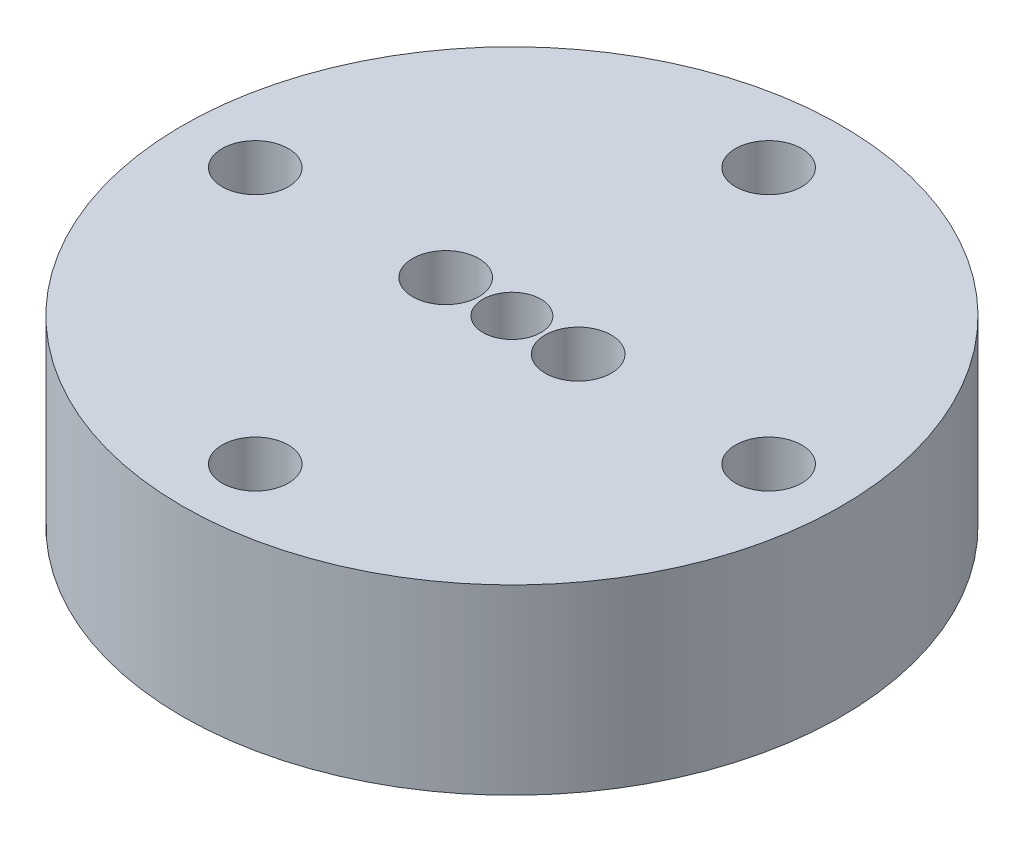
ISO-10303-21;
HEADER;
FILE_DESCRIPTION(('STEP AP214'),'2;1');
FILE_NAME('part.step','',(''),(''),'','','');
FILE_SCHEMA(('AUTOMOTIVE_DESIGN { 1 0 10303 214 1 1 1 1 }'));
ENDSEC;
DATA;
#1=APPLICATION_CONTEXT('core data for automotive mechanical design processes');
#2=APPLICATION_PROTOCOL_DEFINITION('international standard','automotive_design',2000,#1);
#3=PRODUCT_CONTEXT('',#1,'mechanical');
#4=PRODUCT('Part','Part','',(#3));
#5=PRODUCT_RELATED_PRODUCT_CATEGORY('part','',(#4));
#6=PRODUCT_DEFINITION_FORMATION('','',#4);
#7=PRODUCT_DEFINITION_CONTEXT('part definition',#1,'design');
#8=PRODUCT_DEFINITION('design','',#6,#7);
#9=PRODUCT_DEFINITION_SHAPE('','',#8);
#10=(LENGTH_UNIT() NAMED_UNIT(*) SI_UNIT(.MILLI.,.METRE.));
#11=(NAMED_UNIT(*) PLANE_ANGLE_UNIT() SI_UNIT($,.RADIAN.));
#12=(NAMED_UNIT(*) SI_UNIT($,.STERADIAN.) SOLID_ANGLE_UNIT());
#13=UNCERTAINTY_MEASURE_WITH_UNIT(LENGTH_MEASURE(1.E-05),#10,'distance_accuracy_value','');
#14=(GEOMETRIC_REPRESENTATION_CONTEXT(3) GLOBAL_UNCERTAINTY_ASSIGNED_CONTEXT((#13)) GLOBAL_UNIT_ASSIGNED_CONTEXT((#10,
#11,#12)) REPRESENTATION_CONTEXT('',''));
#15=CARTESIAN_POINT('',(0.,0.,0.));
#16=DIRECTION('',(0.,0.,1.));
#17=DIRECTION('',(1.,0.,0.));
#18=AXIS2_PLACEMENT_3D('',#15,#16,#17);
#19=CARTESIAN_POINT('',(0.,11.,0.));
#20=DIRECTION('',(0.,1.,0.));
#21=DIRECTION('',(0.,0.,1.));
#22=AXIS2_PLACEMENT_3D('',#19,#20,#21);
#23=PLANE('',#22);
#24=CARTESIAN_POINT('',(4.,11.,0.));
#25=DIRECTION('',(0.,1.,0.));
#26=DIRECTION('',(0.,0.,1.));
#27=AXIS2_PLACEMENT_3D('',#24,#25,#26);
#28=CIRCLE('',#27,2.);
#29=CARTESIAN_POINT('',(4.,11.,2.));
#30=VERTEX_POINT('',#29);
#31=EDGE_CURVE('E77',#30,#30,#28,.T.);
#32=ORIENTED_EDGE('',*,*,#31,.F.);
#33=EDGE_LOOP('',(#32));
#34=FACE_BOUND('',#33,.T.);
#35=CARTESIAN_POINT('',(-15.4999999999996,11.,4.39587394901923E-13));
#36=DIRECTION('',(0.,1.,0.));
#37=DIRECTION('',(0.,0.,1.));
#38=AXIS2_PLACEMENT_3D('',#35,#36,#37);
#39=CIRCLE('',#38,2.);
#40=CARTESIAN_POINT('',(-15.4999999999996,11.,2.00000000000044));
#41=VERTEX_POINT('',#40);
#42=EDGE_CURVE('E65',#41,#41,#39,.T.);
#43=ORIENTED_EDGE('',*,*,#42,.F.);
#44=EDGE_LOOP('',(#43));
#45=FACE_BOUND('',#44,.T.);
#46=CARTESIAN_POINT('',(15.5000000000004,11.,-4.37689192363245E-13));
#47=DIRECTION('',(0.,1.,0.));
#48=DIRECTION('',(0.,0.,1.));
#49=AXIS2_PLACEMENT_3D('',#46,#47,#48);
#50=CIRCLE('',#49,2.);
#51=CARTESIAN_POINT('',(15.5000000000004,11.,1.99999999999957));
#52=VERTEX_POINT('',#51);
#53=EDGE_CURVE('E53',#52,#52,#50,.T.);
#54=ORIENTED_EDGE('',*,*,#53,.F.);
#55=EDGE_LOOP('',(#54));
#56=FACE_BOUND('',#55,.T.);
#57=CARTESIAN_POINT('',(0.,11.,0.));
#58=DIRECTION('',(0.,1.,0.));
#59=DIRECTION('',(0.,0.,1.));
#60=AXIS2_PLACEMENT_3D('',#57,#58,#59);
#61=CIRCLE('',#60,19.9);
#62=CARTESIAN_POINT('',(0.,11.,19.9));
#63=VERTEX_POINT('',#62);
#64=EDGE_CURVE('E10',#63,#63,#61,.T.);
#65=ORIENTED_EDGE('',*,*,#64,.T.);
#66=EDGE_LOOP('',(#65));
#67=FACE_BOUND('',#66,.T.);
#68=CARTESIAN_POINT('',(0.,11.,-15.5));
#69=DIRECTION('',(0.,1.,0.));
#70=DIRECTION('',(0.,0.,1.));
#71=AXIS2_PLACEMENT_3D('',#68,#69,#70);
#72=CIRCLE('',#71,2.);
#73=CARTESIAN_POINT('',(0.,11.,-13.5));
#74=VERTEX_POINT('',#73);
#75=EDGE_CURVE('E48',#74,#74,#72,.T.);
#76=ORIENTED_EDGE('',*,*,#75,.F.);
#77=EDGE_LOOP('',(#76));
#78=FACE_BOUND('',#77,.T.);
#79=CARTESIAN_POINT('',(8.75378384726489E-13,11.,15.5));
#80=DIRECTION('',(0.,1.,0.));
#81=DIRECTION('',(0.,0.,1.));
#82=AXIS2_PLACEMENT_3D('',#79,#80,#81);
#83=CIRCLE('',#82,2.);
#84=CARTESIAN_POINT('',(8.75378384726489E-13,11.,17.5));
#85=VERTEX_POINT('',#84);
#86=EDGE_CURVE('E59',#85,#85,#83,.T.);
#87=ORIENTED_EDGE('',*,*,#86,.F.);
#88=EDGE_LOOP('',(#87));
#89=FACE_BOUND('',#88,.T.);
#90=CARTESIAN_POINT('',(-4.,11.,0.));
#91=DIRECTION('',(0.,1.,0.));
#92=DIRECTION('',(0.,0.,1.));
#93=AXIS2_PLACEMENT_3D('',#90,#91,#92);
#94=CIRCLE('',#93,2.);
#95=CARTESIAN_POINT('',(-4.,11.,2.));
#96=VERTEX_POINT('',#95);
#97=EDGE_CURVE('E71',#96,#96,#94,.T.);
#98=ORIENTED_EDGE('',*,*,#97,.F.);
#99=EDGE_LOOP('',(#98));
#100=FACE_BOUND('',#99,.T.);
#101=CARTESIAN_POINT('',(0.,11.,0.));
#102=DIRECTION('',(0.,1.,0.));
#103=DIRECTION('',(0.,0.,1.));
#104=AXIS2_PLACEMENT_3D('',#101,#102,#103);
#105=CIRCLE('',#104,1.75);
#106=CARTESIAN_POINT('',(0.,11.,1.75));
#107=VERTEX_POINT('',#106);
#108=EDGE_CURVE('E83',#107,#107,#105,.T.);
#109=ORIENTED_EDGE('',*,*,#108,.F.);
#110=EDGE_LOOP('',(#109));
#111=FACE_BOUND('',#110,.T.);
#112=ADVANCED_FACE('F37',(#34,#45,#56,#67,#78,#89,#100,#111),#23,.T.);
#113=CARTESIAN_POINT('',(0.,0.,0.));
#114=DIRECTION('',(0.,1.,0.));
#115=DIRECTION('',(0.,0.,1.));
#116=AXIS2_PLACEMENT_3D('',#113,#114,#115);
#117=PLANE('',#116);
#118=CARTESIAN_POINT('',(0.,0.,0.));
#119=DIRECTION('',(0.,1.,0.));
#120=DIRECTION('',(0.,0.,1.));
#121=AXIS2_PLACEMENT_3D('',#118,#119,#120);
#122=CIRCLE('',#121,19.9);
#123=CARTESIAN_POINT('',(0.,0.,19.9));
#124=VERTEX_POINT('',#123);
#125=EDGE_CURVE('E41',#124,#124,#122,.T.);
#126=ORIENTED_EDGE('',*,*,#125,.F.);
#127=EDGE_LOOP('',(#126));
#128=FACE_BOUND('',#127,.T.);
#129=CARTESIAN_POINT('',(0.,0.,-15.5));
#130=DIRECTION('',(0.,1.,0.));
#131=DIRECTION('',(0.,0.,1.));
#132=AXIS2_PLACEMENT_3D('',#129,#130,#131);
#133=CIRCLE('',#132,2.);
#134=CARTESIAN_POINT('',(0.,0.,-13.5));
#135=VERTEX_POINT('',#134);
#136=EDGE_CURVE('E50',#135,#135,#133,.T.);
#137=ORIENTED_EDGE('',*,*,#136,.T.);
#138=EDGE_LOOP('',(#137));
#139=FACE_BOUND('',#138,.T.);
#140=CARTESIAN_POINT('',(15.5000000000004,0.,-4.37689192363245E-13));
#141=DIRECTION('',(0.,1.,0.));
#142=DIRECTION('',(0.,0.,1.));
#143=AXIS2_PLACEMENT_3D('',#140,#141,#142);
#144=CIRCLE('',#143,2.);
#145=CARTESIAN_POINT('',(15.5000000000004,0.,1.99999999999957));
#146=VERTEX_POINT('',#145);
#147=EDGE_CURVE('E56',#146,#146,#144,.T.);
#148=ORIENTED_EDGE('',*,*,#147,.T.);
#149=EDGE_LOOP('',(#148));
#150=FACE_BOUND('',#149,.T.);
#151=CARTESIAN_POINT('',(8.75378384726489E-13,0.,15.5));
#152=DIRECTION('',(0.,1.,0.));
#153=DIRECTION('',(0.,0.,1.));
#154=AXIS2_PLACEMENT_3D('',#151,#152,#153);
#155=CIRCLE('',#154,2.);
#156=CARTESIAN_POINT('',(8.75378384726489E-13,0.,17.5));
#157=VERTEX_POINT('',#156);
#158=EDGE_CURVE('E62',#157,#157,#155,.T.);
#159=ORIENTED_EDGE('',*,*,#158,.T.);
#160=EDGE_LOOP('',(#159));
#161=FACE_BOUND('',#160,.T.);
#162=CARTESIAN_POINT('',(-15.4999999999996,0.,4.39587394901923E-13));
#163=DIRECTION('',(0.,1.,0.));
#164=DIRECTION('',(0.,0.,1.));
#165=AXIS2_PLACEMENT_3D('',#162,#163,#164);
#166=CIRCLE('',#165,2.);
#167=CARTESIAN_POINT('',(-15.4999999999996,0.,2.00000000000044));
#168=VERTEX_POINT('',#167);
#169=EDGE_CURVE('E68',#168,#168,#166,.T.);
#170=ORIENTED_EDGE('',*,*,#169,.T.);
#171=EDGE_LOOP('',(#170));
#172=FACE_BOUND('',#171,.T.);
#173=CARTESIAN_POINT('',(-4.,0.,0.));
#174=DIRECTION('',(0.,1.,0.));
#175=DIRECTION('',(0.,0.,1.));
#176=AXIS2_PLACEMENT_3D('',#173,#174,#175);
#177=CIRCLE('',#176,2.);
#178=CARTESIAN_POINT('',(-4.,0.,2.));
#179=VERTEX_POINT('',#178);
#180=EDGE_CURVE('E74',#179,#179,#177,.T.);
#181=ORIENTED_EDGE('',*,*,#180,.T.);
#182=EDGE_LOOP('',(#181));
#183=FACE_BOUND('',#182,.T.);
#184=CARTESIAN_POINT('',(4.,0.,0.));
#185=DIRECTION('',(0.,1.,0.));
#186=DIRECTION('',(0.,0.,1.));
#187=AXIS2_PLACEMENT_3D('',#184,#185,#186);
#188=CIRCLE('',#187,2.);
#189=CARTESIAN_POINT('',(4.,0.,2.));
#190=VERTEX_POINT('',#189);
#191=EDGE_CURVE('E80',#190,#190,#188,.T.);
#192=ORIENTED_EDGE('',*,*,#191,.T.);
#193=EDGE_LOOP('',(#192));
#194=FACE_BOUND('',#193,.T.);
#195=CARTESIAN_POINT('',(0.,0.,0.));
#196=DIRECTION('',(0.,1.,0.));
#197=DIRECTION('',(0.,0.,1.));
#198=AXIS2_PLACEMENT_3D('',#195,#196,#197);
#199=CIRCLE('',#198,1.75);
#200=CARTESIAN_POINT('',(0.,0.,1.75));
#201=VERTEX_POINT('',#200);
#202=EDGE_CURVE('E86',#201,#201,#199,.T.);
#203=ORIENTED_EDGE('',*,*,#202,.T.);
#204=EDGE_LOOP('',(#203));
#205=FACE_BOUND('',#204,.T.);
#206=ADVANCED_FACE('F96',(#128,#139,#150,#161,#172,#183,#194,#205),#117,.F.);
#207=CARTESIAN_POINT('',(0.,11.,0.));
#208=DIRECTION('',(0.,-1.,0.));
#209=DIRECTION('',(0.,0.,-1.));
#210=AXIS2_PLACEMENT_3D('',#207,#208,#209);
#211=CYLINDRICAL_SURFACE('',#210,19.9);
#212=ORIENTED_EDGE('',*,*,#64,.F.);
#213=EDGE_LOOP('',(#212));
#214=FACE_BOUND('',#213,.T.);
#215=ORIENTED_EDGE('',*,*,#125,.T.);
#216=EDGE_LOOP('',(#215));
#217=FACE_BOUND('',#216,.T.);
#218=ADVANCED_FACE('F39',(#214,#217),#211,.T.);
#219=CARTESIAN_POINT('',(0.,11.,-15.5));
#220=DIRECTION('',(0.,-1.,0.));
#221=DIRECTION('',(0.,0.,-1.));
#222=AXIS2_PLACEMENT_3D('',#219,#220,#221);
#223=CYLINDRICAL_SURFACE('',#222,2.);
#224=ORIENTED_EDGE('',*,*,#75,.T.);
#225=EDGE_LOOP('',(#224));
#226=FACE_BOUND('',#225,.T.);
#227=ORIENTED_EDGE('',*,*,#136,.F.);
#228=EDGE_LOOP('',(#227));
#229=FACE_BOUND('',#228,.T.);
#230=ADVANCED_FACE('F106',(#226,#229),#223,.F.);
#231=CARTESIAN_POINT('',(15.5000000000004,11.,-4.37689192363245E-13));
#232=DIRECTION('',(0.,-1.,0.));
#233=DIRECTION('',(0.,0.,-1.));
#234=AXIS2_PLACEMENT_3D('',#231,#232,#233);
#235=CYLINDRICAL_SURFACE('',#234,2.);
#236=ORIENTED_EDGE('',*,*,#53,.T.);
#237=EDGE_LOOP('',(#236));
#238=FACE_BOUND('',#237,.T.);
#239=ORIENTED_EDGE('',*,*,#147,.F.);
#240=EDGE_LOOP('',(#239));
#241=FACE_BOUND('',#240,.T.);
#242=ADVANCED_FACE('F109',(#238,#241),#235,.F.);
#243=CARTESIAN_POINT('',(8.75378384726489E-13,11.,15.5));
#244=DIRECTION('',(0.,-1.,0.));
#245=DIRECTION('',(0.,0.,-1.));
#246=AXIS2_PLACEMENT_3D('',#243,#244,#245);
#247=CYLINDRICAL_SURFACE('',#246,2.);
#248=ORIENTED_EDGE('',*,*,#86,.T.);
#249=EDGE_LOOP('',(#248));
#250=FACE_BOUND('',#249,.T.);
#251=ORIENTED_EDGE('',*,*,#158,.F.);
#252=EDGE_LOOP('',(#251));
#253=FACE_BOUND('',#252,.T.);
#254=ADVANCED_FACE('F113',(#250,#253),#247,.F.);
#255=CARTESIAN_POINT('',(-15.4999999999996,11.,4.39587394901923E-13));
#256=DIRECTION('',(0.,-1.,0.));
#257=DIRECTION('',(0.,0.,-1.));
#258=AXIS2_PLACEMENT_3D('',#255,#256,#257);
#259=CYLINDRICAL_SURFACE('',#258,2.);
#260=ORIENTED_EDGE('',*,*,#42,.T.);
#261=EDGE_LOOP('',(#260));
#262=FACE_BOUND('',#261,.T.);
#263=ORIENTED_EDGE('',*,*,#169,.F.);
#264=EDGE_LOOP('',(#263));
#265=FACE_BOUND('',#264,.T.);
#266=ADVANCED_FACE('F117',(#262,#265),#259,.F.);
#267=CARTESIAN_POINT('',(-4.,11.,0.));
#268=DIRECTION('',(0.,-1.,0.));
#269=DIRECTION('',(0.,0.,-1.));
#270=AXIS2_PLACEMENT_3D('',#267,#268,#269);
#271=CYLINDRICAL_SURFACE('',#270,2.);
#272=ORIENTED_EDGE('',*,*,#97,.T.);
#273=EDGE_LOOP('',(#272));
#274=FACE_BOUND('',#273,.T.);
#275=ORIENTED_EDGE('',*,*,#180,.F.);
#276=EDGE_LOOP('',(#275));
#277=FACE_BOUND('',#276,.T.);
#278=ADVANCED_FACE('F121',(#274,#277),#271,.F.);
#279=CARTESIAN_POINT('',(4.,11.,0.));
#280=DIRECTION('',(0.,-1.,0.));
#281=DIRECTION('',(0.,0.,-1.));
#282=AXIS2_PLACEMENT_3D('',#279,#280,#281);
#283=CYLINDRICAL_SURFACE('',#282,2.);
#284=ORIENTED_EDGE('',*,*,#31,.T.);
#285=EDGE_LOOP('',(#284));
#286=FACE_BOUND('',#285,.T.);
#287=ORIENTED_EDGE('',*,*,#191,.F.);
#288=EDGE_LOOP('',(#287));
#289=FACE_BOUND('',#288,.T.);
#290=ADVANCED_FACE('F125',(#286,#289),#283,.F.);
#291=CARTESIAN_POINT('',(0.,11.,0.));
#292=DIRECTION('',(0.,-1.,0.));
#293=DIRECTION('',(0.,0.,-1.));
#294=AXIS2_PLACEMENT_3D('',#291,#292,#293);
#295=CYLINDRICAL_SURFACE('',#294,1.75);
#296=ORIENTED_EDGE('',*,*,#108,.T.);
#297=EDGE_LOOP('',(#296));
#298=FACE_BOUND('',#297,.T.);
#299=ORIENTED_EDGE('',*,*,#202,.F.);
#300=EDGE_LOOP('',(#299));
#301=FACE_BOUND('',#300,.T.);
#302=ADVANCED_FACE('F92',(#298,#301),#295,.F.);
#303=CLOSED_SHELL('',(#112,#206,#218,#230,#242,#254,#266,#278,#290,#302));
#304=MANIFOLD_SOLID_BREP('B2',#303);
#305=ADVANCED_BREP_SHAPE_REPRESENTATION('',(#18,#304),#14);
#306=SHAPE_DEFINITION_REPRESENTATION(#9,#305);
ENDSEC;
END-ISO-10303-21;
